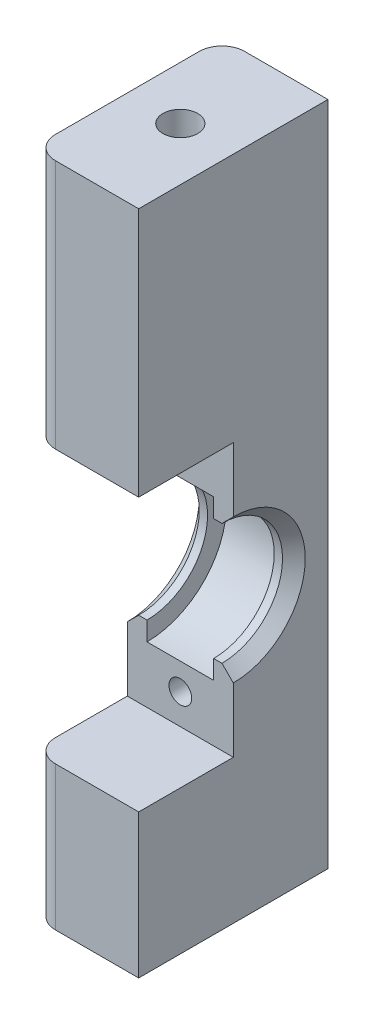
ISO-10303-21;
HEADER;
FILE_DESCRIPTION(('STEP AP214'),'2;1');
FILE_NAME('part.step','',(''),(''),'','','');
FILE_SCHEMA(('AUTOMOTIVE_DESIGN { 1 0 10303 214 1 1 1 1 }'));
ENDSEC;
DATA;
#1=APPLICATION_CONTEXT('core data for automotive mechanical design processes');
#2=APPLICATION_PROTOCOL_DEFINITION('international standard','automotive_design',2000,#1);
#3=PRODUCT_CONTEXT('',#1,'mechanical');
#4=PRODUCT('Part','Part','',(#3));
#5=PRODUCT_RELATED_PRODUCT_CATEGORY('part','',(#4));
#6=PRODUCT_DEFINITION_FORMATION('','',#4);
#7=PRODUCT_DEFINITION_CONTEXT('part definition',#1,'design');
#8=PRODUCT_DEFINITION('design','',#6,#7);
#9=PRODUCT_DEFINITION_SHAPE('','',#8);
#10=(LENGTH_UNIT() NAMED_UNIT(*) SI_UNIT(.MILLI.,.METRE.));
#11=(NAMED_UNIT(*) PLANE_ANGLE_UNIT() SI_UNIT($,.RADIAN.));
#12=(NAMED_UNIT(*) SI_UNIT($,.STERADIAN.) SOLID_ANGLE_UNIT());
#13=UNCERTAINTY_MEASURE_WITH_UNIT(LENGTH_MEASURE(1.E-05),#10,'distance_accuracy_value','');
#14=(GEOMETRIC_REPRESENTATION_CONTEXT(3) GLOBAL_UNCERTAINTY_ASSIGNED_CONTEXT((#13)) GLOBAL_UNIT_ASSIGNED_CONTEXT((#10,
#11,#12)) REPRESENTATION_CONTEXT('',''));
#15=CARTESIAN_POINT('',(0.,0.,0.));
#16=DIRECTION('',(0.,0.,1.));
#17=DIRECTION('',(1.,0.,0.));
#18=AXIS2_PLACEMENT_3D('',#15,#16,#17);
#19=CARTESIAN_POINT('',(-3.5,-22.,12.5));
#20=DIRECTION('',(1.,0.,0.));
#21=DIRECTION('',(0.,0.,-1.));
#22=AXIS2_PLACEMENT_3D('',#19,#20,#21);
#23=PLANE('',#22);
#24=DIRECTION('',(0.,-1.,0.));
#25=VECTOR('',#24,1.);
#26=CARTESIAN_POINT('',(-3.5,5.49999999999999,6.25));
#27=LINE('',#26,#25);
#28=CARTESIAN_POINT('',(-3.5,-8.25000000000003,6.25));
#29=VERTEX_POINT('',#28);
#30=CARTESIAN_POINT('',(-3.5,-12.5,6.25));
#31=VERTEX_POINT('',#30);
#32=EDGE_CURVE('E234',#29,#31,#27,.T.);
#33=ORIENTED_EDGE('',*,*,#32,.F.);
#34=CARTESIAN_POINT('',(-3.5,-3.5,6.25));
#35=DIRECTION('',(1.,0.,0.));
#36=DIRECTION('',(0.,0.,-1.));
#37=AXIS2_PLACEMENT_3D('',#34,#35,#36);
#38=CIRCLE('',#37,4.75000000000002);
#39=CARTESIAN_POINT('',(-3.5,-3.5,1.5));
#40=VERTEX_POINT('',#39);
#41=EDGE_CURVE('E11',#29,#40,#38,.T.);
#42=ORIENTED_EDGE('',*,*,#41,.T.);
#43=DIRECTION('',(0.,-1.,0.));
#44=VECTOR('',#43,1.);
#45=CARTESIAN_POINT('',(-3.5,-22.,1.5));
#46=LINE('',#45,#44);
#47=CARTESIAN_POINT('',(-3.5,-22.,1.5));
#48=VERTEX_POINT('',#47);
#49=EDGE_CURVE('E285',#40,#48,#46,.T.);
#50=ORIENTED_EDGE('',*,*,#49,.T.);
#51=DIRECTION('',(0.,0.,-1.));
#52=VECTOR('',#51,1.);
#53=CARTESIAN_POINT('',(-3.5,-22.,12.5));
#54=LINE('',#53,#52);
#55=CARTESIAN_POINT('',(-3.5,-22.,11.));
#56=VERTEX_POINT('',#55);
#57=EDGE_CURVE('E272',#56,#48,#54,.T.);
#58=ORIENTED_EDGE('',*,*,#57,.F.);
#59=DIRECTION('',(0.,-1.,0.));
#60=VECTOR('',#59,1.);
#61=CARTESIAN_POINT('',(-3.5,-22.,11.));
#62=LINE('',#61,#60);
#63=CARTESIAN_POINT('',(-3.5,-12.5,11.));
#64=VERTEX_POINT('',#63);
#65=EDGE_CURVE('E282',#56,#64,#62,.F.);
#66=ORIENTED_EDGE('',*,*,#65,.T.);
#67=DIRECTION('',(0.,0.,1.));
#68=VECTOR('',#67,1.);
#69=CARTESIAN_POINT('',(-3.5,-12.5,6.25));
#70=LINE('',#69,#68);
#71=EDGE_CURVE('E233',#31,#64,#70,.T.);
#72=ORIENTED_EDGE('',*,*,#71,.F.);
#73=EDGE_LOOP('',(#33,#42,#50,#58,#66,#72));
#74=FACE_BOUND('',#73,.T.);
#75=ADVANCED_FACE('F34',(#74),#23,.F.);
#76=CARTESIAN_POINT('',(3.501,-3.5,6.25));
#77=DIRECTION('',(-1.,0.,0.));
#78=DIRECTION('',(0.,0.,1.));
#79=AXIS2_PLACEMENT_3D('',#76,#77,#78);
#80=CYLINDRICAL_SURFACE('',#79,4.);
#81=DIRECTION('',(-1.,0.,0.));
#82=VECTOR('',#81,1.);
#83=CARTESIAN_POINT('',(3.501,0.499999999999999,6.25));
#84=LINE('',#83,#82);
#85=CARTESIAN_POINT('',(-2.74999999999999,0.499999999999999,6.25));
#86=VERTEX_POINT('',#85);
#87=CARTESIAN_POINT('',(-2.2,0.5,6.25));
#88=VERTEX_POINT('',#87);
#89=EDGE_CURVE('E192',#86,#88,#84,.F.);
#90=ORIENTED_EDGE('',*,*,#89,.F.);
#91=CARTESIAN_POINT('',(-2.74999999999999,-3.5,6.25));
#92=DIRECTION('',(1.,0.,0.));
#93=DIRECTION('',(0.,0.,-1.));
#94=AXIS2_PLACEMENT_3D('',#91,#92,#93);
#95=CIRCLE('',#94,4.);
#96=CARTESIAN_POINT('',(-2.74999999999999,-7.50000000000001,6.25));
#97=VERTEX_POINT('',#96);
#98=EDGE_CURVE('E321',#86,#97,#95,.F.);
#99=ORIENTED_EDGE('',*,*,#98,.T.);
#100=DIRECTION('',(-1.,0.,0.));
#101=VECTOR('',#100,1.);
#102=CARTESIAN_POINT('',(3.501,-7.50000000000001,6.25));
#103=LINE('',#102,#101);
#104=CARTESIAN_POINT('',(-2.2,-7.50000000000001,6.25));
#105=VERTEX_POINT('',#104);
#106=EDGE_CURVE('E215',#105,#97,#103,.T.);
#107=ORIENTED_EDGE('',*,*,#106,.F.);
#108=CARTESIAN_POINT('',(-2.2,-3.5,6.25));
#109=DIRECTION('',(1.,0.,0.));
#110=DIRECTION('',(0.,0.,-1.));
#111=AXIS2_PLACEMENT_3D('',#108,#109,#110);
#112=CIRCLE('',#111,4.);
#113=EDGE_CURVE('E194',#88,#105,#112,.F.);
#114=ORIENTED_EDGE('',*,*,#113,.F.);
#115=EDGE_LOOP('',(#90,#99,#107,#114));
#116=FACE_BOUND('',#115,.T.);
#117=ADVANCED_FACE('F335',(#116),#80,.F.);
#118=CARTESIAN_POINT('',(0.,0.,12.5));
#119=DIRECTION('',(0.,0.,-1.));
#120=DIRECTION('',(-1.,0.,0.));
#121=AXIS2_PLACEMENT_3D('',#118,#119,#120);
#122=PLANE('',#121);
#123=DIRECTION('',(0.,-1.,0.));
#124=VECTOR('',#123,1.);
#125=CARTESIAN_POINT('',(-2.,0.,12.5));
#126=LINE('',#125,#124);
#127=CARTESIAN_POINT('',(-2.,22.,12.5));
#128=VERTEX_POINT('',#127);
#129=CARTESIAN_POINT('',(-2.,5.5,12.5));
#130=VERTEX_POINT('',#129);
#131=EDGE_CURVE('E300',#128,#130,#126,.T.);
#132=ORIENTED_EDGE('',*,*,#131,.T.);
#133=DIRECTION('',(-1.,0.,0.));
#134=VECTOR('',#133,1.);
#135=CARTESIAN_POINT('',(3.501,5.5,12.5));
#136=LINE('',#135,#134);
#137=CARTESIAN_POINT('',(3.5,5.5,12.5));
#138=VERTEX_POINT('',#137);
#139=EDGE_CURVE('E243',#138,#130,#136,.T.);
#140=ORIENTED_EDGE('',*,*,#139,.F.);
#141=DIRECTION('',(0.,1.,0.));
#142=VECTOR('',#141,1.);
#143=CARTESIAN_POINT('',(3.5,-22.,12.5));
#144=LINE('',#143,#142);
#145=CARTESIAN_POINT('',(3.5,22.,12.5));
#146=VERTEX_POINT('',#145);
#147=EDGE_CURVE('E257',#138,#146,#144,.T.);
#148=ORIENTED_EDGE('',*,*,#147,.T.);
#149=DIRECTION('',(-1.,0.,0.));
#150=VECTOR('',#149,1.);
#151=CARTESIAN_POINT('',(-3.5,22.,12.5));
#152=LINE('',#151,#150);
#153=EDGE_CURVE('E256',#146,#128,#152,.T.);
#154=ORIENTED_EDGE('',*,*,#153,.T.);
#155=EDGE_LOOP('',(#132,#140,#148,#154));
#156=FACE_BOUND('',#155,.T.);
#157=ADVANCED_FACE('F384',(#156),#122,.F.);
#158=CARTESIAN_POINT('',(-2.,0.,11.));
#159=DIRECTION('',(0.,-1.,0.));
#160=DIRECTION('',(0.,0.,-1.));
#161=AXIS2_PLACEMENT_3D('',#158,#159,#160);
#162=CYLINDRICAL_SURFACE('',#161,1.5);
#163=CARTESIAN_POINT('',(-2.,5.5,11.));
#164=DIRECTION('',(0.,1.,0.));
#165=DIRECTION('',(0.,0.,1.));
#166=AXIS2_PLACEMENT_3D('',#163,#164,#165);
#167=CIRCLE('',#166,1.5);
#168=CARTESIAN_POINT('',(-3.5,5.5,11.));
#169=VERTEX_POINT('',#168);
#170=EDGE_CURVE('E221',#169,#130,#167,.T.);
#171=ORIENTED_EDGE('',*,*,#170,.T.);
#172=ORIENTED_EDGE('',*,*,#131,.F.);
#173=CARTESIAN_POINT('',(-2.,22.,11.));
#174=DIRECTION('',(0.,-1.,0.));
#175=DIRECTION('',(0.,0.,-1.));
#176=AXIS2_PLACEMENT_3D('',#173,#174,#175);
#177=CIRCLE('',#176,1.5);
#178=CARTESIAN_POINT('',(-3.5,22.,11.));
#179=VERTEX_POINT('',#178);
#180=EDGE_CURVE('E295',#179,#128,#177,.F.);
#181=ORIENTED_EDGE('',*,*,#180,.F.);
#182=EDGE_CURVE('E281',#169,#179,#62,.F.);
#183=ORIENTED_EDGE('',*,*,#182,.F.);
#184=EDGE_LOOP('',(#171,#172,#181,#183));
#185=FACE_BOUND('',#184,.T.);
#186=ADVANCED_FACE('F401',(#185),#162,.T.);
#187=CARTESIAN_POINT('',(3.5,-22.,12.5));
#188=DIRECTION('',(-1.,0.,0.));
#189=DIRECTION('',(0.,0.,1.));
#190=AXIS2_PLACEMENT_3D('',#187,#188,#189);
#191=PLANE('',#190);
#192=DIRECTION('',(0.,1.,0.));
#193=VECTOR('',#192,1.);
#194=CARTESIAN_POINT('',(3.5,5.49999999999999,6.25));
#195=LINE('',#194,#193);
#196=CARTESIAN_POINT('',(3.5,1.25000000000003,6.25));
#197=VERTEX_POINT('',#196);
#198=CARTESIAN_POINT('',(3.5,5.49999999999999,6.25));
#199=VERTEX_POINT('',#198);
#200=EDGE_CURVE('E228',#197,#199,#195,.T.);
#201=ORIENTED_EDGE('',*,*,#200,.F.);
#202=CARTESIAN_POINT('',(3.5,-3.5,6.25));
#203=DIRECTION('',(-1.,0.,0.));
#204=DIRECTION('',(0.,0.,1.));
#205=AXIS2_PLACEMENT_3D('',#202,#203,#204);
#206=CIRCLE('',#205,4.75000000000003);
#207=CARTESIAN_POINT('',(3.5,-8.25000000000003,6.25));
#208=VERTEX_POINT('',#207);
#209=EDGE_CURVE('E316',#197,#208,#206,.T.);
#210=ORIENTED_EDGE('',*,*,#209,.T.);
#211=CARTESIAN_POINT('',(3.5,-12.5,6.25));
#212=VERTEX_POINT('',#211);
#213=EDGE_CURVE('E224',#212,#208,#195,.T.);
#214=ORIENTED_EDGE('',*,*,#213,.F.);
#215=DIRECTION('',(0.,0.,-1.));
#216=VECTOR('',#215,1.);
#217=CARTESIAN_POINT('',(3.5,-12.5,6.25));
#218=LINE('',#217,#216);
#219=CARTESIAN_POINT('',(3.5,-12.5,12.5));
#220=VERTEX_POINT('',#219);
#221=EDGE_CURVE('E242',#220,#212,#218,.T.);
#222=ORIENTED_EDGE('',*,*,#221,.F.);
#223=CARTESIAN_POINT('',(3.5,-22.,12.5));
#224=VERTEX_POINT('',#223);
#225=EDGE_CURVE('E253',#224,#220,#144,.T.);
#226=ORIENTED_EDGE('',*,*,#225,.F.);
#227=DIRECTION('',(0.,0.,-1.));
#228=VECTOR('',#227,1.);
#229=CARTESIAN_POINT('',(3.5,-22.,12.5));
#230=LINE('',#229,#228);
#231=CARTESIAN_POINT('',(3.5,-22.,0.));
#232=VERTEX_POINT('',#231);
#233=EDGE_CURVE('E262',#224,#232,#230,.T.);
#234=ORIENTED_EDGE('',*,*,#233,.T.);
#235=DIRECTION('',(0.,1.,0.));
#236=VECTOR('',#235,1.);
#237=CARTESIAN_POINT('',(3.5,-22.,0.));
#238=LINE('',#237,#236);
#239=CARTESIAN_POINT('',(3.5,22.,0.));
#240=VERTEX_POINT('',#239);
#241=EDGE_CURVE('E252',#232,#240,#238,.T.);
#242=ORIENTED_EDGE('',*,*,#241,.T.);
#243=DIRECTION('',(0.,0.,-1.));
#244=VECTOR('',#243,1.);
#245=CARTESIAN_POINT('',(3.5,22.,12.5));
#246=LINE('',#245,#244);
#247=EDGE_CURVE('E278',#146,#240,#246,.T.);
#248=ORIENTED_EDGE('',*,*,#247,.F.);
#249=ORIENTED_EDGE('',*,*,#147,.F.);
#250=DIRECTION('',(0.,0.,1.));
#251=VECTOR('',#250,1.);
#252=CARTESIAN_POINT('',(3.5,5.49999999999999,6.25));
#253=LINE('',#252,#251);
#254=EDGE_CURVE('E227',#199,#138,#253,.T.);
#255=ORIENTED_EDGE('',*,*,#254,.F.);
#256=EDGE_LOOP('',(#201,#210,#214,#222,#226,#234,#242,#248,#249,#255));
#257=FACE_BOUND('',#256,.T.);
#258=ADVANCED_FACE('F396',(#257),#191,.F.);
#259=CARTESIAN_POINT('',(-3.5,22.,12.5));
#260=DIRECTION('',(0.,-1.,0.));
#261=DIRECTION('',(0.,0.,-1.));
#262=AXIS2_PLACEMENT_3D('',#259,#260,#261);
#263=PLANE('',#262);
#264=CARTESIAN_POINT('',(0.,22.,6.25));
#265=DIRECTION('',(0.,-1.,0.));
#266=DIRECTION('',(0.,0.,-1.));
#267=AXIS2_PLACEMENT_3D('',#264,#265,#266);
#268=CIRCLE('',#267,1.15);
#269=CARTESIAN_POINT('',(0.,22.,5.1));
#270=VERTEX_POINT('',#269);
#271=EDGE_CURVE('E177',#270,#270,#268,.T.);
#272=ORIENTED_EDGE('',*,*,#271,.T.);
#273=EDGE_LOOP('',(#272));
#274=FACE_BOUND('',#273,.T.);
#275=DIRECTION('',(-1.,0.,0.));
#276=VECTOR('',#275,1.);
#277=CARTESIAN_POINT('',(-3.5,22.,0.));
#278=LINE('',#277,#276);
#279=CARTESIAN_POINT('',(-2.,22.,0.));
#280=VERTEX_POINT('',#279);
#281=EDGE_CURVE('E265',#240,#280,#278,.T.);
#282=ORIENTED_EDGE('',*,*,#281,.T.);
#283=CARTESIAN_POINT('',(-2.,22.,1.5));
#284=DIRECTION('',(0.,-1.,0.));
#285=DIRECTION('',(0.,0.,-1.));
#286=AXIS2_PLACEMENT_3D('',#283,#284,#285);
#287=CIRCLE('',#286,1.5);
#288=CARTESIAN_POINT('',(-3.5,22.,1.5));
#289=VERTEX_POINT('',#288);
#290=EDGE_CURVE('E297',#280,#289,#287,.F.);
#291=ORIENTED_EDGE('',*,*,#290,.T.);
#292=DIRECTION('',(0.,0.,-1.));
#293=VECTOR('',#292,1.);
#294=CARTESIAN_POINT('',(-3.5,22.,12.5));
#295=LINE('',#294,#293);
#296=EDGE_CURVE('E275',#179,#289,#295,.T.);
#297=ORIENTED_EDGE('',*,*,#296,.F.);
#298=ORIENTED_EDGE('',*,*,#180,.T.);
#299=ORIENTED_EDGE('',*,*,#153,.F.);
#300=ORIENTED_EDGE('',*,*,#247,.T.);
#301=EDGE_LOOP('',(#282,#291,#297,#298,#299,#300));
#302=FACE_BOUND('',#301,.T.);
#303=ADVANCED_FACE('F389',(#274,#302),#263,.F.);
#304=EDGE_CURVE('E286',#289,#40,#46,.T.);
#305=ORIENTED_EDGE('',*,*,#304,.T.);
#306=CARTESIAN_POINT('',(-3.5,-3.5,6.25));
#307=DIRECTION('',(1.,0.,0.));
#308=DIRECTION('',(0.,0.,-1.));
#309=AXIS2_PLACEMENT_3D('',#306,#307,#308);
#310=CIRCLE('',#309,4.75000000000002);
#311=CARTESIAN_POINT('',(-3.5,1.25000000000002,6.25));
#312=VERTEX_POINT('',#311);
#313=EDGE_CURVE('E42',#40,#312,#310,.T.);
#314=ORIENTED_EDGE('',*,*,#313,.T.);
#315=CARTESIAN_POINT('',(-3.5,5.49999999999999,6.25));
#316=VERTEX_POINT('',#315);
#317=EDGE_CURVE('E230',#316,#312,#27,.T.);
#318=ORIENTED_EDGE('',*,*,#317,.F.);
#319=DIRECTION('',(0.,0.,-1.));
#320=VECTOR('',#319,1.);
#321=CARTESIAN_POINT('',(-3.5,5.49999999999999,6.25));
#322=LINE('',#321,#320);
#323=EDGE_CURVE('E236',#169,#316,#322,.T.);
#324=ORIENTED_EDGE('',*,*,#323,.F.);
#325=ORIENTED_EDGE('',*,*,#182,.T.);
#326=ORIENTED_EDGE('',*,*,#296,.T.);
#327=EDGE_LOOP('',(#305,#314,#318,#324,#325,#326));
#328=FACE_BOUND('',#327,.T.);
#329=ADVANCED_FACE('F326',(#328),#23,.F.);
#330=CARTESIAN_POINT('',(-3.5,-22.,12.5));
#331=DIRECTION('',(0.,1.,0.));
#332=DIRECTION('',(0.,0.,1.));
#333=AXIS2_PLACEMENT_3D('',#330,#331,#332);
#334=PLANE('',#333);
#335=CARTESIAN_POINT('',(0.,-22.,6.25));
#336=DIRECTION('',(0.,-1.,0.));
#337=DIRECTION('',(0.,0.,-1.));
#338=AXIS2_PLACEMENT_3D('',#335,#336,#337);
#339=CIRCLE('',#338,1.15);
#340=CARTESIAN_POINT('',(0.,-22.,5.1));
#341=VERTEX_POINT('',#340);
#342=EDGE_CURVE('E205',#341,#341,#339,.T.);
#343=ORIENTED_EDGE('',*,*,#342,.F.);
#344=EDGE_LOOP('',(#343));
#345=FACE_BOUND('',#344,.T.);
#346=ORIENTED_EDGE('',*,*,#57,.T.);
#347=CARTESIAN_POINT('',(-2.,-22.,1.5));
#348=DIRECTION('',(0.,1.,0.));
#349=DIRECTION('',(0.,0.,1.));
#350=AXIS2_PLACEMENT_3D('',#347,#348,#349);
#351=CIRCLE('',#350,1.5);
#352=CARTESIAN_POINT('',(-2.,-22.,0.));
#353=VERTEX_POINT('',#352);
#354=EDGE_CURVE('E291',#48,#353,#351,.F.);
#355=ORIENTED_EDGE('',*,*,#354,.T.);
#356=DIRECTION('',(1.,0.,0.));
#357=VECTOR('',#356,1.);
#358=CARTESIAN_POINT('',(-3.5,-22.,0.));
#359=LINE('',#358,#357);
#360=EDGE_CURVE('E268',#353,#232,#359,.T.);
#361=ORIENTED_EDGE('',*,*,#360,.T.);
#362=ORIENTED_EDGE('',*,*,#233,.F.);
#363=DIRECTION('',(1.,0.,0.));
#364=VECTOR('',#363,1.);
#365=CARTESIAN_POINT('',(-3.5,-22.,12.5));
#366=LINE('',#365,#364);
#367=CARTESIAN_POINT('',(-2.,-22.,12.5));
#368=VERTEX_POINT('',#367);
#369=EDGE_CURVE('E260',#368,#224,#366,.T.);
#370=ORIENTED_EDGE('',*,*,#369,.F.);
#371=CARTESIAN_POINT('',(-2.,-22.,11.));
#372=DIRECTION('',(0.,1.,0.));
#373=DIRECTION('',(0.,0.,1.));
#374=AXIS2_PLACEMENT_3D('',#371,#372,#373);
#375=CIRCLE('',#374,1.5);
#376=EDGE_CURVE('E289',#368,#56,#375,.F.);
#377=ORIENTED_EDGE('',*,*,#376,.T.);
#378=EDGE_LOOP('',(#346,#355,#361,#362,#370,#377));
#379=FACE_BOUND('',#378,.T.);
#380=ADVANCED_FACE('F388',(#345,#379),#334,.F.);
#381=ORIENTED_EDGE('',*,*,#225,.T.);
#382=DIRECTION('',(-1.,0.,0.));
#383=VECTOR('',#382,1.);
#384=CARTESIAN_POINT('',(3.501,-12.5,12.5));
#385=LINE('',#384,#383);
#386=CARTESIAN_POINT('',(-2.,-12.5,12.5));
#387=VERTEX_POINT('',#386);
#388=EDGE_CURVE('E245',#220,#387,#385,.T.);
#389=ORIENTED_EDGE('',*,*,#388,.T.);
#390=EDGE_CURVE('E299',#387,#368,#126,.T.);
#391=ORIENTED_EDGE('',*,*,#390,.T.);
#392=ORIENTED_EDGE('',*,*,#369,.T.);
#393=EDGE_LOOP('',(#381,#389,#391,#392));
#394=FACE_BOUND('',#393,.T.);
#395=ADVANCED_FACE('F394',(#394),#122,.F.);
#396=CARTESIAN_POINT('',(0.,0.,0.));
#397=DIRECTION('',(0.,0.,-1.));
#398=DIRECTION('',(-1.,0.,0.));
#399=AXIS2_PLACEMENT_3D('',#396,#397,#398);
#400=PLANE('',#399);
#401=ORIENTED_EDGE('',*,*,#360,.F.);
#402=DIRECTION('',(0.,-1.,0.));
#403=VECTOR('',#402,1.);
#404=CARTESIAN_POINT('',(-2.,22.,0.));
#405=LINE('',#404,#403);
#406=EDGE_CURVE('E293',#353,#280,#405,.F.);
#407=ORIENTED_EDGE('',*,*,#406,.T.);
#408=ORIENTED_EDGE('',*,*,#281,.F.);
#409=ORIENTED_EDGE('',*,*,#241,.F.);
#410=EDGE_LOOP('',(#401,#407,#408,#409));
#411=FACE_BOUND('',#410,.T.);
#412=ADVANCED_FACE('F409',(#411),#400,.T.);
#413=CARTESIAN_POINT('',(-2.,-22.,1.5));
#414=DIRECTION('',(0.,1.,0.));
#415=DIRECTION('',(0.,0.,1.));
#416=AXIS2_PLACEMENT_3D('',#413,#414,#415);
#417=CYLINDRICAL_SURFACE('',#416,1.5);
#418=ORIENTED_EDGE('',*,*,#290,.F.);
#419=ORIENTED_EDGE('',*,*,#406,.F.);
#420=ORIENTED_EDGE('',*,*,#354,.F.);
#421=ORIENTED_EDGE('',*,*,#49,.F.);
#422=ORIENTED_EDGE('',*,*,#304,.F.);
#423=EDGE_LOOP('',(#418,#419,#420,#421,#422));
#424=FACE_BOUND('',#423,.T.);
#425=ADVANCED_FACE('F406',(#424),#417,.T.);
#426=CARTESIAN_POINT('',(-2.,-12.5,11.));
#427=DIRECTION('',(0.,-1.,0.));
#428=DIRECTION('',(0.,0.,-1.));
#429=AXIS2_PLACEMENT_3D('',#426,#427,#428);
#430=CIRCLE('',#429,1.5);
#431=EDGE_CURVE('E218',#387,#64,#430,.T.);
#432=ORIENTED_EDGE('',*,*,#431,.T.);
#433=ORIENTED_EDGE('',*,*,#65,.F.);
#434=ORIENTED_EDGE('',*,*,#376,.F.);
#435=ORIENTED_EDGE('',*,*,#390,.F.);
#436=EDGE_LOOP('',(#432,#433,#434,#435));
#437=FACE_BOUND('',#436,.T.);
#438=ADVANCED_FACE('F372',(#437),#162,.T.);
#439=CARTESIAN_POINT('',(2.74999999999997,-7.50000000000001,6.25));
#440=VERTEX_POINT('',#439);
#441=CARTESIAN_POINT('',(2.2,-7.50000000000001,6.25));
#442=VERTEX_POINT('',#441);
#443=EDGE_CURVE('E216',#440,#442,#103,.T.);
#444=ORIENTED_EDGE('',*,*,#443,.F.);
#445=CARTESIAN_POINT('',(2.74999999999997,-3.5,6.25));
#446=DIRECTION('',(-1.,0.,0.));
#447=DIRECTION('',(0.,0.,1.));
#448=AXIS2_PLACEMENT_3D('',#445,#446,#447);
#449=CIRCLE('',#448,4.);
#450=CARTESIAN_POINT('',(2.74999999999997,0.499999999999999,6.25));
#451=VERTEX_POINT('',#450);
#452=EDGE_CURVE('E309',#440,#451,#449,.F.);
#453=ORIENTED_EDGE('',*,*,#452,.T.);
#454=CARTESIAN_POINT('',(2.2,0.5,6.25));
#455=VERTEX_POINT('',#454);
#456=EDGE_CURVE('E211',#455,#451,#84,.F.);
#457=ORIENTED_EDGE('',*,*,#456,.F.);
#458=CARTESIAN_POINT('',(2.2,-3.5,6.25));
#459=DIRECTION('',(1.,0.,0.));
#460=DIRECTION('',(0.,0.,-1.));
#461=AXIS2_PLACEMENT_3D('',#458,#459,#460);
#462=CIRCLE('',#461,4.);
#463=EDGE_CURVE('E193',#455,#442,#462,.F.);
#464=ORIENTED_EDGE('',*,*,#463,.T.);
#465=EDGE_LOOP('',(#444,#453,#457,#464));
#466=FACE_BOUND('',#465,.T.);
#467=ADVANCED_FACE('F364',(#466),#80,.F.);
#468=CARTESIAN_POINT('',(3.501,5.49999999999999,6.25));
#469=DIRECTION('',(0.,0.,-1.));
#470=DIRECTION('',(0.,1.,0.));
#471=AXIS2_PLACEMENT_3D('',#468,#469,#470);
#472=PLANE('',#471);
#473=CARTESIAN_POINT('',(0.,3.50000000000002,6.25));
#474=DIRECTION('',(0.,0.,1.));
#475=DIRECTION('',(1.,0.,0.));
#476=AXIS2_PLACEMENT_3D('',#473,#474,#475);
#477=CIRCLE('',#476,0.749999999999995);
#478=CARTESIAN_POINT('',(0.749999999999992,3.50000000000002,6.25));
#479=VERTEX_POINT('',#478);
#480=EDGE_CURVE('E347',#479,#479,#477,.T.);
#481=ORIENTED_EDGE('',*,*,#480,.F.);
#482=EDGE_LOOP('',(#481));
#483=FACE_BOUND('',#482,.T.);
#484=ORIENTED_EDGE('',*,*,#456,.T.);
#485=DIRECTION('',(0.707106781186544,0.707106781186551,0.));
#486=VECTOR('',#485,1.);
#487=CARTESIAN_POINT('',(-1.24999999999999,-3.5,6.25));
#488=LINE('',#487,#486);
#489=EDGE_CURVE('E314',#451,#197,#488,.T.);
#490=ORIENTED_EDGE('',*,*,#489,.T.);
#491=ORIENTED_EDGE('',*,*,#200,.T.);
#492=DIRECTION('',(-1.,0.,0.));
#493=VECTOR('',#492,1.);
#494=CARTESIAN_POINT('',(3.501,5.49999999999999,6.25));
#495=LINE('',#494,#493);
#496=EDGE_CURVE('E240',#199,#316,#495,.T.);
#497=ORIENTED_EDGE('',*,*,#496,.T.);
#498=ORIENTED_EDGE('',*,*,#317,.T.);
#499=DIRECTION('',(0.707106781186545,-0.70710678118655,0.));
#500=VECTOR('',#499,1.);
#501=CARTESIAN_POINT('',(1.24999999999998,-3.5,6.25));
#502=LINE('',#501,#500);
#503=EDGE_CURVE('E312',#312,#86,#502,.T.);
#504=ORIENTED_EDGE('',*,*,#503,.T.);
#505=ORIENTED_EDGE('',*,*,#89,.T.);
#506=DIRECTION('',(0.,-1.,0.));
#507=VECTOR('',#506,1.);
#508=CARTESIAN_POINT('',(-2.2,5.49999999999999,6.25));
#509=LINE('',#508,#507);
#510=CARTESIAN_POINT('',(-2.2,1.75,6.25));
#511=VERTEX_POINT('',#510);
#512=EDGE_CURVE('E183',#511,#88,#509,.T.);
#513=ORIENTED_EDGE('',*,*,#512,.F.);
#514=DIRECTION('',(-1.,0.,0.));
#515=VECTOR('',#514,1.);
#516=CARTESIAN_POINT('',(2.2,1.75,6.25));
#517=LINE('',#516,#515);
#518=CARTESIAN_POINT('',(2.2,1.75,6.25));
#519=VERTEX_POINT('',#518);
#520=EDGE_CURVE('E167',#519,#511,#517,.T.);
#521=ORIENTED_EDGE('',*,*,#520,.F.);
#522=DIRECTION('',(0.,-1.,0.));
#523=VECTOR('',#522,1.);
#524=CARTESIAN_POINT('',(2.2,5.49999999999999,6.25));
#525=LINE('',#524,#523);
#526=EDGE_CURVE('E178',#519,#455,#525,.T.);
#527=ORIENTED_EDGE('',*,*,#526,.T.);
#528=EDGE_LOOP('',(#484,#490,#491,#497,#498,#504,#505,#513,#521,#527));
#529=FACE_BOUND('',#528,.T.);
#530=ADVANCED_FACE('F190',(#483,#529),#472,.F.);
#531=CARTESIAN_POINT('',(3.501,5.49999999999999,6.25));
#532=DIRECTION('',(0.,1.,0.));
#533=DIRECTION('',(0.,0.,1.));
#534=AXIS2_PLACEMENT_3D('',#531,#532,#533);
#535=PLANE('',#534);
#536=ORIENTED_EDGE('',*,*,#254,.T.);
#537=ORIENTED_EDGE('',*,*,#139,.T.);
#538=ORIENTED_EDGE('',*,*,#170,.F.);
#539=ORIENTED_EDGE('',*,*,#323,.T.);
#540=ORIENTED_EDGE('',*,*,#496,.F.);
#541=EDGE_LOOP('',(#536,#537,#538,#539,#540));
#542=FACE_BOUND('',#541,.T.);
#543=ADVANCED_FACE('F363',(#542),#535,.F.);
#544=CARTESIAN_POINT('',(0.,-10.5,6.25));
#545=DIRECTION('',(0.,0.,1.));
#546=DIRECTION('',(1.,0.,0.));
#547=AXIS2_PLACEMENT_3D('',#544,#545,#546);
#548=CIRCLE('',#547,0.750000000000028);
#549=CARTESIAN_POINT('',(0.750000000000025,-10.5,6.25));
#550=VERTEX_POINT('',#549);
#551=EDGE_CURVE('E341',#550,#550,#548,.T.);
#552=ORIENTED_EDGE('',*,*,#551,.F.);
#553=EDGE_LOOP('',(#552));
#554=FACE_BOUND('',#553,.T.);
#555=ORIENTED_EDGE('',*,*,#213,.T.);
#556=DIRECTION('',(-0.707106781186544,0.707106781186551,0.));
#557=VECTOR('',#556,1.);
#558=CARTESIAN_POINT('',(-1.24999999999999,-3.5,6.25));
#559=LINE('',#558,#557);
#560=EDGE_CURVE('E319',#208,#440,#559,.T.);
#561=ORIENTED_EDGE('',*,*,#560,.T.);
#562=ORIENTED_EDGE('',*,*,#443,.T.);
#563=DIRECTION('',(0.,-1.,0.));
#564=VECTOR('',#563,1.);
#565=CARTESIAN_POINT('',(2.2,5.49999999999999,6.25));
#566=LINE('',#565,#564);
#567=CARTESIAN_POINT('',(2.2,-8.75,6.25));
#568=VERTEX_POINT('',#567);
#569=EDGE_CURVE('E306',#442,#568,#566,.T.);
#570=ORIENTED_EDGE('',*,*,#569,.T.);
#571=DIRECTION('',(-1.,0.,0.));
#572=VECTOR('',#571,1.);
#573=CARTESIAN_POINT('',(2.2,-8.75,6.25));
#574=LINE('',#573,#572);
#575=CARTESIAN_POINT('',(-2.2,-8.75,6.25));
#576=VERTEX_POINT('',#575);
#577=EDGE_CURVE('E304',#576,#568,#574,.F.);
#578=ORIENTED_EDGE('',*,*,#577,.F.);
#579=DIRECTION('',(0.,-1.,0.));
#580=VECTOR('',#579,1.);
#581=CARTESIAN_POINT('',(-2.2,5.49999999999999,6.25));
#582=LINE('',#581,#580);
#583=EDGE_CURVE('E186',#105,#576,#582,.T.);
#584=ORIENTED_EDGE('',*,*,#583,.F.);
#585=ORIENTED_EDGE('',*,*,#106,.T.);
#586=DIRECTION('',(-0.707106781186545,-0.70710678118655,0.));
#587=VECTOR('',#586,1.);
#588=CARTESIAN_POINT('',(1.24999999999998,-3.5,6.25));
#589=LINE('',#588,#587);
#590=EDGE_CURVE('E55',#97,#29,#589,.T.);
#591=ORIENTED_EDGE('',*,*,#590,.T.);
#592=ORIENTED_EDGE('',*,*,#32,.T.);
#593=DIRECTION('',(-1.,0.,0.));
#594=VECTOR('',#593,1.);
#595=CARTESIAN_POINT('',(3.501,-12.5,6.25));
#596=LINE('',#595,#594);
#597=EDGE_CURVE('E239',#212,#31,#596,.T.);
#598=ORIENTED_EDGE('',*,*,#597,.F.);
#599=EDGE_LOOP('',(#555,#561,#562,#570,#578,#584,#585,#591,#592,#598));
#600=FACE_BOUND('',#599,.T.);
#601=ADVANCED_FACE('F336',(#554,#600),#472,.F.);
#602=CARTESIAN_POINT('',(3.501,-12.5,6.25));
#603=DIRECTION('',(0.,-1.,0.));
#604=DIRECTION('',(0.,0.,-1.));
#605=AXIS2_PLACEMENT_3D('',#602,#603,#604);
#606=PLANE('',#605);
#607=ORIENTED_EDGE('',*,*,#221,.T.);
#608=ORIENTED_EDGE('',*,*,#597,.T.);
#609=ORIENTED_EDGE('',*,*,#71,.T.);
#610=ORIENTED_EDGE('',*,*,#431,.F.);
#611=ORIENTED_EDGE('',*,*,#388,.F.);
#612=EDGE_LOOP('',(#607,#608,#609,#610,#611));
#613=FACE_BOUND('',#612,.T.);
#614=ADVANCED_FACE('F377',(#613),#606,.F.);
#615=CARTESIAN_POINT('',(0.,-14.,6.25));
#616=DIRECTION('',(0.,-1.,0.));
#617=DIRECTION('',(0.,0.,-1.));
#618=AXIS2_PLACEMENT_3D('',#615,#616,#617);
#619=CYLINDRICAL_SURFACE('',#618,1.15);
#620=CARTESIAN_POINT('',(0.,-14.,6.25));
#621=DIRECTION('',(0.,-1.,0.));
#622=DIRECTION('',(0.,0.,-1.));
#623=AXIS2_PLACEMENT_3D('',#620,#621,#622);
#624=CIRCLE('',#623,1.15);
#625=CARTESIAN_POINT('',(0.,-14.,5.1));
#626=VERTEX_POINT('',#625);
#627=EDGE_CURVE('E208',#626,#626,#624,.T.);
#628=ORIENTED_EDGE('',*,*,#627,.F.);
#629=EDGE_LOOP('',(#628));
#630=FACE_BOUND('',#629,.T.);
#631=ORIENTED_EDGE('',*,*,#342,.T.);
#632=EDGE_LOOP('',(#631));
#633=FACE_BOUND('',#632,.T.);
#634=ADVANCED_FACE('F596',(#630,#633),#619,.F.);
#635=CARTESIAN_POINT('',(0.,-14.,6.25));
#636=DIRECTION('',(0.,-1.,0.));
#637=DIRECTION('',(0.,0.,-1.));
#638=AXIS2_PLACEMENT_3D('',#635,#636,#637);
#639=PLANE('',#638);
#640=ORIENTED_EDGE('',*,*,#627,.T.);
#641=EDGE_LOOP('',(#640));
#642=FACE_BOUND('',#641,.T.);
#643=ADVANCED_FACE('F587',(#642),#639,.T.);
#644=CARTESIAN_POINT('',(0.,14.,6.25));
#645=DIRECTION('',(0.,1.,0.));
#646=DIRECTION('',(0.,0.,1.));
#647=AXIS2_PLACEMENT_3D('',#644,#645,#646);
#648=CYLINDRICAL_SURFACE('',#647,1.15);
#649=CARTESIAN_POINT('',(0.,14.,6.25));
#650=DIRECTION('',(0.,-1.,0.));
#651=DIRECTION('',(0.,0.,-1.));
#652=AXIS2_PLACEMENT_3D('',#649,#650,#651);
#653=CIRCLE('',#652,1.15);
#654=CARTESIAN_POINT('',(0.,14.,5.1));
#655=VERTEX_POINT('',#654);
#656=EDGE_CURVE('E202',#655,#655,#653,.T.);
#657=ORIENTED_EDGE('',*,*,#656,.T.);
#658=EDGE_LOOP('',(#657));
#659=FACE_BOUND('',#658,.T.);
#660=ORIENTED_EDGE('',*,*,#271,.F.);
#661=EDGE_LOOP('',(#660));
#662=FACE_BOUND('',#661,.T.);
#663=ADVANCED_FACE('F578',(#659,#662),#648,.F.);
#664=CARTESIAN_POINT('',(0.,14.,6.25));
#665=DIRECTION('',(0.,1.,0.));
#666=DIRECTION('',(0.,0.,-1.));
#667=AXIS2_PLACEMENT_3D('',#664,#665,#666);
#668=PLANE('',#667);
#669=ORIENTED_EDGE('',*,*,#656,.F.);
#670=EDGE_LOOP('',(#669));
#671=FACE_BOUND('',#670,.T.);
#672=ADVANCED_FACE('F565',(#671),#668,.T.);
#673=CARTESIAN_POINT('',(2.2,-3.5,6.25));
#674=DIRECTION('',(-1.,0.,0.));
#675=DIRECTION('',(0.,0.,1.));
#676=AXIS2_PLACEMENT_3D('',#673,#674,#675);
#677=CYLINDRICAL_SURFACE('',#676,5.25);
#678=ORIENTED_EDGE('',*,*,#520,.T.);
#679=CARTESIAN_POINT('',(-2.2,-3.5,6.25));
#680=DIRECTION('',(1.,0.,0.));
#681=DIRECTION('',(0.,0.,-1.));
#682=AXIS2_PLACEMENT_3D('',#679,#680,#681);
#683=CIRCLE('',#682,5.25);
#684=EDGE_CURVE('E170',#576,#511,#683,.T.);
#685=ORIENTED_EDGE('',*,*,#684,.F.);
#686=ORIENTED_EDGE('',*,*,#577,.T.);
#687=CARTESIAN_POINT('',(2.2,-3.5,6.25));
#688=DIRECTION('',(1.,0.,0.));
#689=DIRECTION('',(0.,0.,-1.));
#690=AXIS2_PLACEMENT_3D('',#687,#688,#689);
#691=CIRCLE('',#690,5.25);
#692=EDGE_CURVE('E173',#568,#519,#691,.T.);
#693=ORIENTED_EDGE('',*,*,#692,.T.);
#694=EDGE_LOOP('',(#678,#685,#686,#693));
#695=FACE_BOUND('',#694,.T.);
#696=ADVANCED_FACE('F169',(#695),#677,.F.);
#697=CARTESIAN_POINT('',(2.2,-3.5,6.25));
#698=DIRECTION('',(1.,0.,0.));
#699=DIRECTION('',(0.,0.,-1.));
#700=AXIS2_PLACEMENT_3D('',#697,#698,#699);
#701=PLANE('',#700);
#702=ORIENTED_EDGE('',*,*,#692,.F.);
#703=ORIENTED_EDGE('',*,*,#569,.F.);
#704=ORIENTED_EDGE('',*,*,#463,.F.);
#705=ORIENTED_EDGE('',*,*,#526,.F.);
#706=EDGE_LOOP('',(#702,#703,#704,#705));
#707=FACE_BOUND('',#706,.T.);
#708=ADVANCED_FACE('F339',(#707),#701,.F.);
#709=CARTESIAN_POINT('',(-2.2,-3.5,6.25));
#710=DIRECTION('',(1.,0.,0.));
#711=DIRECTION('',(0.,0.,-1.));
#712=AXIS2_PLACEMENT_3D('',#709,#710,#711);
#713=PLANE('',#712);
#714=ORIENTED_EDGE('',*,*,#512,.T.);
#715=ORIENTED_EDGE('',*,*,#113,.T.);
#716=ORIENTED_EDGE('',*,*,#583,.T.);
#717=ORIENTED_EDGE('',*,*,#684,.T.);
#718=EDGE_LOOP('',(#714,#715,#716,#717));
#719=FACE_BOUND('',#718,.T.);
#720=ADVANCED_FACE('F182',(#719),#713,.T.);
#721=CARTESIAN_POINT('',(0.,-10.5,0.750000000000001));
#722=DIRECTION('',(0.,0.,1.));
#723=DIRECTION('',(1.,0.,0.));
#724=AXIS2_PLACEMENT_3D('',#721,#722,#723);
#725=CYLINDRICAL_SURFACE('',#724,0.750000000000028);
#726=CARTESIAN_POINT('',(0.,-10.5,0.750000000000001));
#727=DIRECTION('',(0.,0.,1.));
#728=DIRECTION('',(1.,0.,0.));
#729=AXIS2_PLACEMENT_3D('',#726,#727,#728);
#730=CIRCLE('',#729,0.750000000000028);
#731=CARTESIAN_POINT('',(0.750000000000025,-10.5,0.750000000000001));
#732=VERTEX_POINT('',#731);
#733=EDGE_CURVE('E344',#732,#732,#730,.T.);
#734=ORIENTED_EDGE('',*,*,#733,.F.);
#735=EDGE_LOOP('',(#734));
#736=FACE_BOUND('',#735,.T.);
#737=ORIENTED_EDGE('',*,*,#551,.T.);
#738=EDGE_LOOP('',(#737));
#739=FACE_BOUND('',#738,.T.);
#740=ADVANCED_FACE('F534',(#736,#739),#725,.F.);
#741=CARTESIAN_POINT('',(0.,-10.5,0.750000000000001));
#742=DIRECTION('',(0.,0.,1.));
#743=DIRECTION('',(1.,0.,0.));
#744=AXIS2_PLACEMENT_3D('',#741,#742,#743);
#745=PLANE('',#744);
#746=ORIENTED_EDGE('',*,*,#733,.T.);
#747=EDGE_LOOP('',(#746));
#748=FACE_BOUND('',#747,.T.);
#749=ADVANCED_FACE('F358',(#748),#745,.T.);
#750=CARTESIAN_POINT('',(0.,3.50000000000002,0.750000000000001));
#751=DIRECTION('',(0.,0.,1.));
#752=DIRECTION('',(1.,0.,0.));
#753=AXIS2_PLACEMENT_3D('',#750,#751,#752);
#754=CYLINDRICAL_SURFACE('',#753,0.749999999999995);
#755=CARTESIAN_POINT('',(0.,3.50000000000002,0.750000000000001));
#756=DIRECTION('',(0.,0.,1.));
#757=DIRECTION('',(1.,0.,0.));
#758=AXIS2_PLACEMENT_3D('',#755,#756,#757);
#759=CIRCLE('',#758,0.749999999999995);
#760=CARTESIAN_POINT('',(0.749999999999992,3.50000000000002,0.750000000000001));
#761=VERTEX_POINT('',#760);
#762=EDGE_CURVE('E187',#761,#761,#759,.T.);
#763=ORIENTED_EDGE('',*,*,#762,.F.);
#764=EDGE_LOOP('',(#763));
#765=FACE_BOUND('',#764,.T.);
#766=ORIENTED_EDGE('',*,*,#480,.T.);
#767=EDGE_LOOP('',(#766));
#768=FACE_BOUND('',#767,.T.);
#769=ADVANCED_FACE('F355',(#765,#768),#754,.F.);
#770=CARTESIAN_POINT('',(0.,3.50000000000002,0.750000000000001));
#771=DIRECTION('',(0.,0.,1.));
#772=DIRECTION('',(1.,0.,0.));
#773=AXIS2_PLACEMENT_3D('',#770,#771,#772);
#774=PLANE('',#773);
#775=ORIENTED_EDGE('',*,*,#762,.T.);
#776=EDGE_LOOP('',(#775));
#777=FACE_BOUND('',#776,.T.);
#778=ADVANCED_FACE('F353',(#777),#774,.T.);
#779=CARTESIAN_POINT('',(2.74999999999997,-3.5,6.25));
#780=DIRECTION('',(1.,0.,0.));
#781=DIRECTION('',(0.,0.,-1.));
#782=AXIS2_PLACEMENT_3D('',#779,#780,#781);
#783=CONICAL_SURFACE('',#782,4.,0.785398163397453);
#784=ORIENTED_EDGE('',*,*,#560,.F.);
#785=ORIENTED_EDGE('',*,*,#209,.F.);
#786=ORIENTED_EDGE('',*,*,#489,.F.);
#787=ORIENTED_EDGE('',*,*,#452,.F.);
#788=EDGE_LOOP('',(#784,#785,#786,#787));
#789=FACE_BOUND('',#788,.T.);
#790=ADVANCED_FACE('F413',(#789),#783,.F.);
#791=CARTESIAN_POINT('',(-2.74999999999999,-3.5,6.25));
#792=DIRECTION('',(-1.,0.,0.));
#793=DIRECTION('',(0.,0.,1.));
#794=AXIS2_PLACEMENT_3D('',#791,#792,#793);
#795=CONICAL_SURFACE('',#794,4.,0.785398163397452);
#796=ORIENTED_EDGE('',*,*,#313,.F.);
#797=ORIENTED_EDGE('',*,*,#41,.F.);
#798=ORIENTED_EDGE('',*,*,#590,.F.);
#799=ORIENTED_EDGE('',*,*,#98,.F.);
#800=ORIENTED_EDGE('',*,*,#503,.F.);
#801=EDGE_LOOP('',(#796,#797,#798,#799,#800));
#802=FACE_BOUND('',#801,.T.);
#803=ADVANCED_FACE('F36',(#802),#795,.F.);
#804=CLOSED_SHELL('',(#75,#117,#157,#186,#258,#303,#329,#380,#395,#412,#425,#438,#467,#530,#543,
#601,#614,#634,#643,#663,#672,#696,#708,#720,#740,#749,#769,#778,#790,#803));
#805=MANIFOLD_SOLID_BREP('B2',#804);
#806=ADVANCED_BREP_SHAPE_REPRESENTATION('',(#18,#805),#14);
#807=SHAPE_DEFINITION_REPRESENTATION(#9,#806);
ENDSEC;
END-ISO-10303-21;
